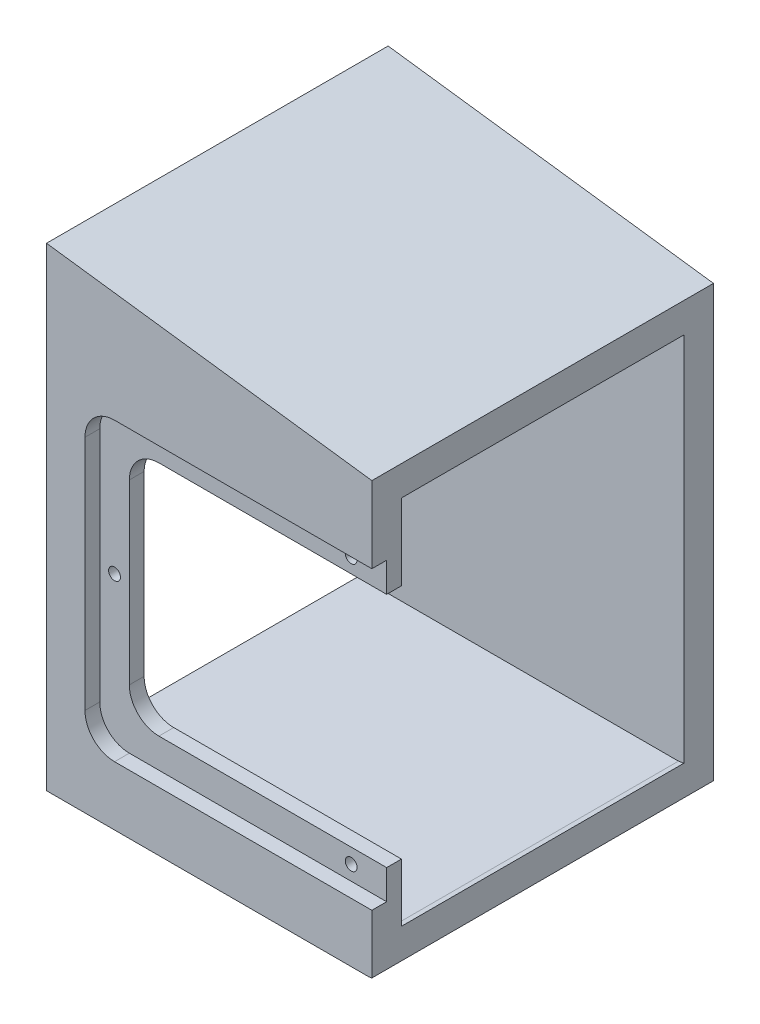
ISO-10303-21;
HEADER;
FILE_DESCRIPTION(('STEP AP214'),'2;1');
FILE_NAME('part.step','',(''),(''),'','','');
FILE_SCHEMA(('AUTOMOTIVE_DESIGN { 1 0 10303 214 1 1 1 1 }'));
ENDSEC;
DATA;
#1=APPLICATION_CONTEXT('core data for automotive mechanical design processes');
#2=APPLICATION_PROTOCOL_DEFINITION('international standard','automotive_design',2000,#1);
#3=PRODUCT_CONTEXT('',#1,'mechanical');
#4=PRODUCT('Part','Part','',(#3));
#5=PRODUCT_RELATED_PRODUCT_CATEGORY('part','',(#4));
#6=PRODUCT_DEFINITION_FORMATION('','',#4);
#7=PRODUCT_DEFINITION_CONTEXT('part definition',#1,'design');
#8=PRODUCT_DEFINITION('design','',#6,#7);
#9=PRODUCT_DEFINITION_SHAPE('','',#8);
#10=(LENGTH_UNIT() NAMED_UNIT(*) SI_UNIT(.MILLI.,.METRE.));
#11=(NAMED_UNIT(*) PLANE_ANGLE_UNIT() SI_UNIT($,.RADIAN.));
#12=(NAMED_UNIT(*) SI_UNIT($,.STERADIAN.) SOLID_ANGLE_UNIT());
#13=UNCERTAINTY_MEASURE_WITH_UNIT(LENGTH_MEASURE(1.E-05),#10,'distance_accuracy_value','');
#14=(GEOMETRIC_REPRESENTATION_CONTEXT(3) GLOBAL_UNCERTAINTY_ASSIGNED_CONTEXT((#13)) GLOBAL_UNIT_ASSIGNED_CONTEXT((#10,
#11,#12)) REPRESENTATION_CONTEXT('',''));
#15=CARTESIAN_POINT('',(0.,0.,0.));
#16=DIRECTION('',(0.,0.,1.));
#17=DIRECTION('',(1.,0.,0.));
#18=AXIS2_PLACEMENT_3D('',#15,#16,#17);
#19=CARTESIAN_POINT('',(82.,0.,0.));
#20=DIRECTION('',(1.,0.,0.));
#21=DIRECTION('',(0.,0.,-1.));
#22=AXIS2_PLACEMENT_3D('',#19,#20,#21);
#23=PLANE('',#22);
#24=DIRECTION('',(0.,1.,0.));
#25=VECTOR('',#24,1.);
#26=CARTESIAN_POINT('',(82.,0.,57.75));
#27=LINE('',#26,#25);
#28=CARTESIAN_POINT('',(82.,-118.,57.75));
#29=VERTEX_POINT('',#28);
#30=CARTESIAN_POINT('',(82.,42.3112777177944,57.75));
#31=VERTEX_POINT('',#30);
#32=EDGE_CURVE('E285',#29,#31,#27,.T.);
#33=ORIENTED_EDGE('',*,*,#32,.T.);
#34=DIRECTION('',(0.,0.,1.));
#35=VECTOR('',#34,1.);
#36=CARTESIAN_POINT('',(82.,42.3112777177944,57.75));
#37=LINE('',#36,#35);
#38=CARTESIAN_POINT('',(82.,42.3112777177944,-57.75));
#39=VERTEX_POINT('',#38);
#40=EDGE_CURVE('E218',#39,#31,#37,.T.);
#41=ORIENTED_EDGE('',*,*,#40,.F.);
#42=DIRECTION('',(0.,1.,0.));
#43=VECTOR('',#42,1.);
#44=CARTESIAN_POINT('',(82.,0.,-57.75));
#45=LINE('',#44,#43);
#46=CARTESIAN_POINT('',(82.,-118.,-57.75));
#47=VERTEX_POINT('',#46);
#48=EDGE_CURVE('E342',#47,#39,#45,.T.);
#49=ORIENTED_EDGE('',*,*,#48,.F.);
#50=DIRECTION('',(0.,0.,-1.));
#51=VECTOR('',#50,1.);
#52=CARTESIAN_POINT('',(82.,-118.,57.75));
#53=LINE('',#52,#51);
#54=EDGE_CURVE('E345',#29,#47,#53,.T.);
#55=ORIENTED_EDGE('',*,*,#54,.F.);
#56=EDGE_LOOP('',(#33,#41,#49,#55));
#57=FACE_BOUND('',#56,.T.);
#58=DIRECTION('',(0.,0.,-1.));
#59=VECTOR('',#58,1.);
#60=CARTESIAN_POINT('',(82.,-108.,57.75));
#61=LINE('',#60,#59);
#62=CARTESIAN_POINT('',(82.,-108.,47.75));
#63=VERTEX_POINT('',#62);
#64=CARTESIAN_POINT('',(82.,-108.,-47.75));
#65=VERTEX_POINT('',#64);
#66=EDGE_CURVE('E290',#63,#65,#61,.T.);
#67=ORIENTED_EDGE('',*,*,#66,.T.);
#68=DIRECTION('',(0.,1.,0.));
#69=VECTOR('',#68,1.);
#70=CARTESIAN_POINT('',(82.,0.,-47.75));
#71=LINE('',#70,#69);
#72=CARTESIAN_POINT('',(82.,32.2247568314438,-47.75));
#73=VERTEX_POINT('',#72);
#74=EDGE_CURVE('E45',#65,#73,#71,.T.);
#75=ORIENTED_EDGE('',*,*,#74,.T.);
#76=DIRECTION('',(0.,0.,1.));
#77=VECTOR('',#76,1.);
#78=CARTESIAN_POINT('',(82.,32.2247568314438,57.75));
#79=LINE('',#78,#77);
#80=CARTESIAN_POINT('',(82.,32.2247568314438,47.75));
#81=VERTEX_POINT('',#80);
#82=EDGE_CURVE('E292',#73,#81,#79,.T.);
#83=ORIENTED_EDGE('',*,*,#82,.T.);
#84=DIRECTION('',(0.,1.,0.));
#85=VECTOR('',#84,1.);
#86=CARTESIAN_POINT('',(82.,0.,47.75));
#87=LINE('',#86,#85);
#88=EDGE_CURVE('E330',#63,#81,#87,.T.);
#89=ORIENTED_EDGE('',*,*,#88,.F.);
#90=EDGE_LOOP('',(#67,#75,#83,#89));
#91=FACE_BOUND('',#90,.T.);
#92=ADVANCED_FACE('F41',(#57,#91),#23,.F.);
#93=CARTESIAN_POINT('',(192.,0.,0.));
#94=DIRECTION('',(1.,0.,0.));
#95=DIRECTION('',(0.,0.,-1.));
#96=AXIS2_PLACEMENT_3D('',#93,#94,#95);
#97=PLANE('',#96);
#98=DIRECTION('',(0.,-1.,0.));
#99=VECTOR('',#98,1.);
#100=CARTESIAN_POINT('',(192.,-88.0000000000001,52.75));
#101=LINE('',#100,#99);
#102=CARTESIAN_POINT('',(192.,1.99999999999996,52.75));
#103=VERTEX_POINT('',#102);
#104=CARTESIAN_POINT('',(192.,-8.00000000000004,52.75));
#105=VERTEX_POINT('',#104);
#106=EDGE_CURVE('E308',#103,#105,#101,.T.);
#107=ORIENTED_EDGE('',*,*,#106,.T.);
#108=DIRECTION('',(0.,0.,-1.));
#109=VECTOR('',#108,1.);
#110=CARTESIAN_POINT('',(192.,-8.00000000000004,-57.751));
#111=LINE('',#110,#109);
#112=CARTESIAN_POINT('',(192.,-8.00000000000004,47.75));
#113=VERTEX_POINT('',#112);
#114=EDGE_CURVE('E306',#105,#113,#111,.T.);
#115=ORIENTED_EDGE('',*,*,#114,.T.);
#116=DIRECTION('',(0.,1.,0.));
#117=VECTOR('',#116,1.);
#118=CARTESIAN_POINT('',(192.,0.,47.75));
#119=LINE('',#118,#117);
#120=CARTESIAN_POINT('',(192.,17.7235039722908,47.75));
#121=VERTEX_POINT('',#120);
#122=EDGE_CURVE('E298',#113,#121,#119,.T.);
#123=ORIENTED_EDGE('',*,*,#122,.T.);
#124=DIRECTION('',(0.,0.,1.));
#125=VECTOR('',#124,1.);
#126=CARTESIAN_POINT('',(192.,17.7235039722908,57.75));
#127=LINE('',#126,#125);
#128=CARTESIAN_POINT('',(192.,17.7235039722908,-47.75));
#129=VERTEX_POINT('',#128);
#130=EDGE_CURVE('E325',#129,#121,#127,.T.);
#131=ORIENTED_EDGE('',*,*,#130,.F.);
#132=DIRECTION('',(0.,1.,0.));
#133=VECTOR('',#132,1.);
#134=CARTESIAN_POINT('',(192.,0.,-47.75));
#135=LINE('',#134,#133);
#136=CARTESIAN_POINT('',(192.,-107.686529193614,-47.75));
#137=VERTEX_POINT('',#136);
#138=EDGE_CURVE('E327',#137,#129,#135,.T.);
#139=ORIENTED_EDGE('',*,*,#138,.F.);
#140=DIRECTION('',(0.,0.,-1.));
#141=VECTOR('',#140,1.);
#142=CARTESIAN_POINT('',(192.,-107.686529193614,57.75));
#143=LINE('',#142,#141);
#144=CARTESIAN_POINT('',(192.,-107.686529193614,47.75));
#145=VERTEX_POINT('',#144);
#146=EDGE_CURVE('E331',#145,#137,#143,.T.);
#147=ORIENTED_EDGE('',*,*,#146,.F.);
#148=CARTESIAN_POINT('',(192.,-88.0000000000001,47.75));
#149=VERTEX_POINT('',#148);
#150=EDGE_CURVE('E294',#145,#149,#119,.T.);
#151=ORIENTED_EDGE('',*,*,#150,.T.);
#152=DIRECTION('',(0.,0.,-1.));
#153=VECTOR('',#152,1.);
#154=CARTESIAN_POINT('',(192.,-88.0000000000001,-57.751));
#155=LINE('',#154,#153);
#156=CARTESIAN_POINT('',(192.,-88.0000000000001,52.75));
#157=VERTEX_POINT('',#156);
#158=EDGE_CURVE('E284',#157,#149,#155,.T.);
#159=ORIENTED_EDGE('',*,*,#158,.F.);
#160=CARTESIAN_POINT('',(192.,-98.,52.75));
#161=VERTEX_POINT('',#160);
#162=EDGE_CURVE('E225',#157,#161,#101,.T.);
#163=ORIENTED_EDGE('',*,*,#162,.T.);
#164=DIRECTION('',(0.,0.,1.));
#165=VECTOR('',#164,1.);
#166=CARTESIAN_POINT('',(192.,-98.,52.75));
#167=LINE('',#166,#165);
#168=CARTESIAN_POINT('',(192.,-98.,57.75));
#169=VERTEX_POINT('',#168);
#170=EDGE_CURVE('E204',#161,#169,#167,.T.);
#171=ORIENTED_EDGE('',*,*,#170,.T.);
#172=DIRECTION('',(0.,1.,0.));
#173=VECTOR('',#172,1.);
#174=CARTESIAN_POINT('',(192.,0.,57.75));
#175=LINE('',#174,#173);
#176=CARTESIAN_POINT('',(192.,-117.83,57.75));
#177=VERTEX_POINT('',#176);
#178=EDGE_CURVE('E210',#177,#169,#175,.T.);
#179=ORIENTED_EDGE('',*,*,#178,.F.);
#180=DIRECTION('',(0.,0.,-1.));
#181=VECTOR('',#180,1.);
#182=CARTESIAN_POINT('',(192.,-117.83,57.75));
#183=LINE('',#182,#181);
#184=CARTESIAN_POINT('',(192.,-117.83,-57.75));
#185=VERTEX_POINT('',#184);
#186=EDGE_CURVE('E344',#177,#185,#183,.T.);
#187=ORIENTED_EDGE('',*,*,#186,.T.);
#188=DIRECTION('',(0.,1.,0.));
#189=VECTOR('',#188,1.);
#190=CARTESIAN_POINT('',(192.,0.,-57.75));
#191=LINE('',#190,#189);
#192=CARTESIAN_POINT('',(192.,27.8100248586414,-57.75));
#193=VERTEX_POINT('',#192);
#194=EDGE_CURVE('E289',#185,#193,#191,.T.);
#195=ORIENTED_EDGE('',*,*,#194,.T.);
#196=DIRECTION('',(0.,0.,1.));
#197=VECTOR('',#196,1.);
#198=CARTESIAN_POINT('',(192.,27.8100248586414,57.75));
#199=LINE('',#198,#197);
#200=CARTESIAN_POINT('',(192.,27.8100248586414,57.75));
#201=VERTEX_POINT('',#200);
#202=EDGE_CURVE('E288',#193,#201,#199,.T.);
#203=ORIENTED_EDGE('',*,*,#202,.T.);
#204=CARTESIAN_POINT('',(192.,1.99999999999996,57.75));
#205=VERTEX_POINT('',#204);
#206=EDGE_CURVE('E217',#205,#201,#175,.T.);
#207=ORIENTED_EDGE('',*,*,#206,.F.);
#208=DIRECTION('',(0.,0.,-1.));
#209=VECTOR('',#208,1.);
#210=CARTESIAN_POINT('',(192.,1.99999999999996,52.75));
#211=LINE('',#210,#209);
#212=EDGE_CURVE('E226',#205,#103,#211,.T.);
#213=ORIENTED_EDGE('',*,*,#212,.T.);
#214=EDGE_LOOP('',(#107,#115,#123,#131,#139,#147,#151,#159,#163,#171,#179,#187,#195,#203,#207,#213));
#215=FACE_BOUND('',#214,.T.);
#216=ADVANCED_FACE('F222',(#215),#97,.T.);
#217=CARTESIAN_POINT('',(274.,17.,57.75));
#218=DIRECTION('',(-0.130698754240664,-0.991422127874872,0.));
#219=DIRECTION('',(0.991422127874872,-0.130698754240664,0.));
#220=AXIS2_PLACEMENT_3D('',#217,#218,#219);
#221=PLANE('',#220);
#222=ORIENTED_EDGE('',*,*,#202,.F.);
#223=DIRECTION('',(-0.991422127874872,0.130698754240664,0.));
#224=VECTOR('',#223,1.);
#225=CARTESIAN_POINT('',(274.,17.,-57.75));
#226=LINE('',#225,#224);
#227=EDGE_CURVE('E247',#193,#39,#226,.T.);
#228=ORIENTED_EDGE('',*,*,#227,.T.);
#229=ORIENTED_EDGE('',*,*,#40,.T.);
#230=DIRECTION('',(-0.991422127874872,0.130698754240664,0.));
#231=VECTOR('',#230,1.);
#232=CARTESIAN_POINT('',(274.,17.,57.75));
#233=LINE('',#232,#231);
#234=EDGE_CURVE('E243',#201,#31,#233,.T.);
#235=ORIENTED_EDGE('',*,*,#234,.F.);
#236=EDGE_LOOP('',(#222,#228,#229,#235));
#237=FACE_BOUND('',#236,.T.);
#238=ADVANCED_FACE('F352',(#237),#221,.F.);
#239=CARTESIAN_POINT('',(191.,-118.,57.75));
#240=DIRECTION('',(0.,1.,0.));
#241=DIRECTION('',(-1.,0.,0.));
#242=AXIS2_PLACEMENT_3D('',#239,#240,#241);
#243=PLANE('',#242);
#244=DIRECTION('',(1.,0.,0.));
#245=VECTOR('',#244,1.);
#246=CARTESIAN_POINT('',(191.,-118.,57.75));
#247=LINE('',#246,#245);
#248=CARTESIAN_POINT('',(191.,-118.,57.75));
#249=VERTEX_POINT('',#248);
#250=EDGE_CURVE('E242',#29,#249,#247,.T.);
#251=ORIENTED_EDGE('',*,*,#250,.F.);
#252=ORIENTED_EDGE('',*,*,#54,.T.);
#253=DIRECTION('',(1.,0.,0.));
#254=VECTOR('',#253,1.);
#255=CARTESIAN_POINT('',(191.,-118.,-57.75));
#256=LINE('',#255,#254);
#257=CARTESIAN_POINT('',(191.,-118.,-57.75));
#258=VERTEX_POINT('',#257);
#259=EDGE_CURVE('E246',#47,#258,#256,.T.);
#260=ORIENTED_EDGE('',*,*,#259,.T.);
#261=DIRECTION('',(0.,0.,-1.));
#262=VECTOR('',#261,1.);
#263=CARTESIAN_POINT('',(191.,-118.,57.75));
#264=LINE('',#263,#262);
#265=EDGE_CURVE('E276',#249,#258,#264,.T.);
#266=ORIENTED_EDGE('',*,*,#265,.F.);
#267=EDGE_LOOP('',(#251,#252,#260,#266));
#268=FACE_BOUND('',#267,.T.);
#269=ADVANCED_FACE('F452',(#268),#243,.F.);
#270=CARTESIAN_POINT('',(291.,-101.,57.75));
#271=DIRECTION('',(-0.167595493933869,0.985855846669817,0.));
#272=DIRECTION('',(-0.985855846669818,-0.167595493933869,0.));
#273=AXIS2_PLACEMENT_3D('',#270,#271,#272);
#274=PLANE('',#273);
#275=ORIENTED_EDGE('',*,*,#186,.F.);
#276=DIRECTION('',(0.985855846669817,0.167595493933869,0.));
#277=VECTOR('',#276,1.);
#278=CARTESIAN_POINT('',(291.,-101.,57.75));
#279=LINE('',#278,#277);
#280=EDGE_CURVE('E213',#249,#177,#279,.T.);
#281=ORIENTED_EDGE('',*,*,#280,.F.);
#282=ORIENTED_EDGE('',*,*,#265,.T.);
#283=DIRECTION('',(0.985855846669817,0.167595493933869,0.));
#284=VECTOR('',#283,1.);
#285=CARTESIAN_POINT('',(291.,-101.,-57.75));
#286=LINE('',#285,#284);
#287=EDGE_CURVE('E244',#258,#185,#286,.T.);
#288=ORIENTED_EDGE('',*,*,#287,.T.);
#289=EDGE_LOOP('',(#275,#281,#282,#288));
#290=FACE_BOUND('',#289,.T.);
#291=ADVANCED_FACE('F455',(#290),#274,.F.);
#292=CARTESIAN_POINT('',(0.,0.,-57.75));
#293=DIRECTION('',(0.,0.,1.));
#294=DIRECTION('',(1.,0.,0.));
#295=AXIS2_PLACEMENT_3D('',#292,#293,#294);
#296=PLANE('',#295);
#297=ORIENTED_EDGE('',*,*,#194,.F.);
#298=ORIENTED_EDGE('',*,*,#287,.F.);
#299=ORIENTED_EDGE('',*,*,#259,.F.);
#300=ORIENTED_EDGE('',*,*,#48,.T.);
#301=ORIENTED_EDGE('',*,*,#227,.F.);
#302=EDGE_LOOP('',(#297,#298,#299,#300,#301));
#303=FACE_BOUND('',#302,.T.);
#304=ADVANCED_FACE('F450',(#303),#296,.F.);
#305=CARTESIAN_POINT('',(191.,-108.,57.75));
#306=DIRECTION('',(0.,1.,0.));
#307=DIRECTION('',(-1.,0.,0.));
#308=AXIS2_PLACEMENT_3D('',#305,#306,#307);
#309=PLANE('',#308);
#310=ORIENTED_EDGE('',*,*,#66,.F.);
#311=DIRECTION('',(1.,0.,0.));
#312=VECTOR('',#311,1.);
#313=CARTESIAN_POINT('',(191.,-108.,47.75));
#314=LINE('',#313,#312);
#315=CARTESIAN_POINT('',(190.156054080084,-108.,47.75));
#316=VERTEX_POINT('',#315);
#317=EDGE_CURVE('E234',#63,#316,#314,.T.);
#318=ORIENTED_EDGE('',*,*,#317,.T.);
#319=DIRECTION('',(0.,0.,-1.));
#320=VECTOR('',#319,1.);
#321=CARTESIAN_POINT('',(190.156054080084,-108.,57.75));
#322=LINE('',#321,#320);
#323=CARTESIAN_POINT('',(190.156054080084,-108.,-47.75));
#324=VERTEX_POINT('',#323);
#325=EDGE_CURVE('E240',#316,#324,#322,.T.);
#326=ORIENTED_EDGE('',*,*,#325,.T.);
#327=DIRECTION('',(1.,0.,0.));
#328=VECTOR('',#327,1.);
#329=CARTESIAN_POINT('',(191.,-108.,-47.75));
#330=LINE('',#329,#328);
#331=EDGE_CURVE('E239',#65,#324,#330,.T.);
#332=ORIENTED_EDGE('',*,*,#331,.F.);
#333=EDGE_LOOP('',(#310,#318,#326,#332));
#334=FACE_BOUND('',#333,.T.);
#335=ADVANCED_FACE('F447',(#334),#309,.T.);
#336=CARTESIAN_POINT('',(272.693012457593,7.08577872125128,57.75));
#337=DIRECTION('',(-0.130698754240664,-0.991422127874872,0.));
#338=DIRECTION('',(0.991422127874872,-0.130698754240664,0.));
#339=AXIS2_PLACEMENT_3D('',#336,#337,#338);
#340=PLANE('',#339);
#341=DIRECTION('',(-0.991422127874872,0.130698754240664,0.));
#342=VECTOR('',#341,1.);
#343=CARTESIAN_POINT('',(272.693012457593,7.08577872125128,-47.75));
#344=LINE('',#343,#342);
#345=EDGE_CURVE('E278',#129,#73,#344,.T.);
#346=ORIENTED_EDGE('',*,*,#345,.F.);
#347=ORIENTED_EDGE('',*,*,#130,.T.);
#348=DIRECTION('',(-0.991422127874872,0.130698754240664,0.));
#349=VECTOR('',#348,1.);
#350=CARTESIAN_POINT('',(272.693012457593,7.08577872125128,47.75));
#351=LINE('',#350,#349);
#352=EDGE_CURVE('E235',#121,#81,#351,.T.);
#353=ORIENTED_EDGE('',*,*,#352,.T.);
#354=ORIENTED_EDGE('',*,*,#82,.F.);
#355=EDGE_LOOP('',(#346,#347,#353,#354));
#356=FACE_BOUND('',#355,.T.);
#357=ADVANCED_FACE('F333',(#356),#340,.T.);
#358=CARTESIAN_POINT('',(289.324045060661,-91.1414415333018,57.75));
#359=DIRECTION('',(-0.167595493933869,0.985855846669817,0.));
#360=DIRECTION('',(-0.985855846669818,-0.167595493933869,0.));
#361=AXIS2_PLACEMENT_3D('',#358,#359,#360);
#362=PLANE('',#361);
#363=DIRECTION('',(0.985855846669818,0.167595493933869,0.));
#364=VECTOR('',#363,1.);
#365=CARTESIAN_POINT('',(289.324045060661,-91.1414415333018,47.75));
#366=LINE('',#365,#364);
#367=EDGE_CURVE('E232',#316,#145,#366,.T.);
#368=ORIENTED_EDGE('',*,*,#367,.T.);
#369=ORIENTED_EDGE('',*,*,#146,.T.);
#370=DIRECTION('',(0.985855846669818,0.167595493933869,0.));
#371=VECTOR('',#370,1.);
#372=CARTESIAN_POINT('',(289.324045060661,-91.1414415333018,-47.75));
#373=LINE('',#372,#371);
#374=EDGE_CURVE('E236',#324,#137,#373,.T.);
#375=ORIENTED_EDGE('',*,*,#374,.F.);
#376=ORIENTED_EDGE('',*,*,#325,.F.);
#377=EDGE_LOOP('',(#368,#369,#375,#376));
#378=FACE_BOUND('',#377,.T.);
#379=ADVANCED_FACE('F493',(#378),#362,.T.);
#380=CARTESIAN_POINT('',(0.,0.,-47.75));
#381=DIRECTION('',(0.,0.,1.));
#382=DIRECTION('',(1.,0.,0.));
#383=AXIS2_PLACEMENT_3D('',#380,#381,#382);
#384=PLANE('',#383);
#385=ORIENTED_EDGE('',*,*,#374,.T.);
#386=ORIENTED_EDGE('',*,*,#138,.T.);
#387=ORIENTED_EDGE('',*,*,#345,.T.);
#388=ORIENTED_EDGE('',*,*,#74,.F.);
#389=ORIENTED_EDGE('',*,*,#331,.T.);
#390=EDGE_LOOP('',(#385,#386,#387,#388,#389));
#391=FACE_BOUND('',#390,.T.);
#392=ADVANCED_FACE('F335',(#391),#384,.T.);
#393=CARTESIAN_POINT('',(0.,0.,47.75));
#394=DIRECTION('',(0.,0.,1.));
#395=DIRECTION('',(1.,0.,0.));
#396=AXIS2_PLACEMENT_3D('',#393,#394,#395);
#397=PLANE('',#396);
#398=CARTESIAN_POINT('',(99.9971523214083,-48.,47.75));
#399=DIRECTION('',(0.,0.,1.));
#400=DIRECTION('',(1.,0.,0.));
#401=AXIS2_PLACEMENT_3D('',#398,#399,#400);
#402=CIRCLE('',#401,2.);
#403=CARTESIAN_POINT('',(101.997152321408,-48.,47.75));
#404=VERTEX_POINT('',#403);
#405=EDGE_CURVE('E11',#404,#404,#402,.T.);
#406=ORIENTED_EDGE('',*,*,#405,.T.);
#407=EDGE_LOOP('',(#406));
#408=FACE_BOUND('',#407,.T.);
#409=CARTESIAN_POINT('',(180.,-93.,47.75));
#410=DIRECTION('',(0.,0.,1.));
#411=DIRECTION('',(1.,0.,0.));
#412=AXIS2_PLACEMENT_3D('',#409,#410,#411);
#413=CIRCLE('',#412,2.);
#414=CARTESIAN_POINT('',(182.,-93.,47.75));
#415=VERTEX_POINT('',#414);
#416=EDGE_CURVE('E407',#415,#415,#413,.T.);
#417=ORIENTED_EDGE('',*,*,#416,.T.);
#418=EDGE_LOOP('',(#417));
#419=FACE_BOUND('',#418,.T.);
#420=CARTESIAN_POINT('',(180.,-3.00000000000003,47.75));
#421=DIRECTION('',(0.,0.,1.));
#422=DIRECTION('',(1.,0.,0.));
#423=AXIS2_PLACEMENT_3D('',#420,#421,#422);
#424=CIRCLE('',#423,2.);
#425=CARTESIAN_POINT('',(182.,-3.00000000000003,47.75));
#426=VERTEX_POINT('',#425);
#427=EDGE_CURVE('E399',#426,#426,#424,.T.);
#428=ORIENTED_EDGE('',*,*,#427,.T.);
#429=EDGE_LOOP('',(#428));
#430=FACE_BOUND('',#429,.T.);
#431=ORIENTED_EDGE('',*,*,#150,.F.);
#432=ORIENTED_EDGE('',*,*,#367,.F.);
#433=ORIENTED_EDGE('',*,*,#317,.F.);
#434=ORIENTED_EDGE('',*,*,#88,.T.);
#435=ORIENTED_EDGE('',*,*,#352,.F.);
#436=ORIENTED_EDGE('',*,*,#122,.F.);
#437=DIRECTION('',(1.,0.,0.));
#438=VECTOR('',#437,1.);
#439=CARTESIAN_POINT('',(0.,-8.00000000000006,47.75));
#440=LINE('',#439,#438);
#441=CARTESIAN_POINT('',(115.,-8.00000000000005,47.75));
#442=VERTEX_POINT('',#441);
#443=EDGE_CURVE('E253',#442,#113,#440,.T.);
#444=ORIENTED_EDGE('',*,*,#443,.F.);
#445=CARTESIAN_POINT('',(115.,-18.,47.75));
#446=DIRECTION('',(0.,0.,1.));
#447=DIRECTION('',(1.,0.,0.));
#448=AXIS2_PLACEMENT_3D('',#445,#446,#447);
#449=CIRCLE('',#448,10.);
#450=CARTESIAN_POINT('',(105.,-18.0000000000001,47.75));
#451=VERTEX_POINT('',#450);
#452=EDGE_CURVE('E256',#451,#442,#449,.F.);
#453=ORIENTED_EDGE('',*,*,#452,.F.);
#454=DIRECTION('',(0.,-1.,0.));
#455=VECTOR('',#454,1.);
#456=CARTESIAN_POINT('',(105.,0.,47.75));
#457=LINE('',#456,#455);
#458=CARTESIAN_POINT('',(105.,-78.,47.75));
#459=VERTEX_POINT('',#458);
#460=EDGE_CURVE('E379',#451,#459,#457,.T.);
#461=ORIENTED_EDGE('',*,*,#460,.T.);
#462=CARTESIAN_POINT('',(115.,-78.0000000000001,47.75));
#463=DIRECTION('',(0.,0.,1.));
#464=DIRECTION('',(1.,0.,0.));
#465=AXIS2_PLACEMENT_3D('',#462,#463,#464);
#466=CIRCLE('',#465,9.99999999999999);
#467=CARTESIAN_POINT('',(115.,-88.0000000000001,47.75));
#468=VERTEX_POINT('',#467);
#469=EDGE_CURVE('E251',#459,#468,#466,.T.);
#470=ORIENTED_EDGE('',*,*,#469,.T.);
#471=DIRECTION('',(1.,0.,0.));
#472=VECTOR('',#471,1.);
#473=CARTESIAN_POINT('',(0.,-88.0000000000001,47.75));
#474=LINE('',#473,#472);
#475=EDGE_CURVE('E248',#468,#149,#474,.T.);
#476=ORIENTED_EDGE('',*,*,#475,.T.);
#477=EDGE_LOOP('',(#431,#432,#433,#434,#435,#436,#444,#453,#461,#470,#476));
#478=FACE_BOUND('',#477,.T.);
#479=ADVANCED_FACE('F322',(#408,#419,#430,#478),#397,.F.);
#480=CARTESIAN_POINT('',(0.,-8.00000000000006,-57.751));
#481=DIRECTION('',(0.,1.,0.));
#482=DIRECTION('',(-1.,0.,0.));
#483=AXIS2_PLACEMENT_3D('',#480,#481,#482);
#484=PLANE('',#483);
#485=ORIENTED_EDGE('',*,*,#114,.F.);
#486=DIRECTION('',(-1.,0.,0.));
#487=VECTOR('',#486,1.);
#488=CARTESIAN_POINT('',(0.,-8.00000000000006,52.75));
#489=LINE('',#488,#487);
#490=CARTESIAN_POINT('',(115.,-8.00000000000005,52.75));
#491=VERTEX_POINT('',#490);
#492=EDGE_CURVE('E259',#105,#491,#489,.T.);
#493=ORIENTED_EDGE('',*,*,#492,.T.);
#494=DIRECTION('',(0.,0.,1.));
#495=VECTOR('',#494,1.);
#496=CARTESIAN_POINT('',(115.,-8.00000000000005,-57.751));
#497=LINE('',#496,#495);
#498=EDGE_CURVE('E252',#442,#491,#497,.T.);
#499=ORIENTED_EDGE('',*,*,#498,.F.);
#500=ORIENTED_EDGE('',*,*,#443,.T.);
#501=EDGE_LOOP('',(#485,#493,#499,#500));
#502=FACE_BOUND('',#501,.T.);
#503=ADVANCED_FACE('F316',(#502),#484,.F.);
#504=CARTESIAN_POINT('',(115.,-18.,-57.751));
#505=DIRECTION('',(0.,0.,1.));
#506=DIRECTION('',(1.,0.,0.));
#507=AXIS2_PLACEMENT_3D('',#504,#505,#506);
#508=CYLINDRICAL_SURFACE('',#507,10.);
#509=ORIENTED_EDGE('',*,*,#498,.T.);
#510=CARTESIAN_POINT('',(115.,-18.,52.75));
#511=DIRECTION('',(0.,0.,-1.));
#512=DIRECTION('',(-1.,0.,0.));
#513=AXIS2_PLACEMENT_3D('',#510,#511,#512);
#514=CIRCLE('',#513,10.);
#515=CARTESIAN_POINT('',(105.,-18.,52.75));
#516=VERTEX_POINT('',#515);
#517=EDGE_CURVE('E261',#491,#516,#514,.F.);
#518=ORIENTED_EDGE('',*,*,#517,.T.);
#519=DIRECTION('',(0.,0.,1.));
#520=VECTOR('',#519,1.);
#521=CARTESIAN_POINT('',(105.,-18.0000000000001,-57.751));
#522=LINE('',#521,#520);
#523=EDGE_CURVE('E369',#451,#516,#522,.T.);
#524=ORIENTED_EDGE('',*,*,#523,.F.);
#525=ORIENTED_EDGE('',*,*,#452,.T.);
#526=EDGE_LOOP('',(#509,#518,#524,#525));
#527=FACE_BOUND('',#526,.T.);
#528=ADVANCED_FACE('F457',(#527),#508,.F.);
#529=CARTESIAN_POINT('',(105.,0.,-57.751));
#530=DIRECTION('',(1.,0.,0.));
#531=DIRECTION('',(0.,0.,-1.));
#532=AXIS2_PLACEMENT_3D('',#529,#530,#531);
#533=PLANE('',#532);
#534=DIRECTION('',(0.,1.,0.));
#535=VECTOR('',#534,1.);
#536=CARTESIAN_POINT('',(105.,0.,52.75));
#537=LINE('',#536,#535);
#538=CARTESIAN_POINT('',(105.,-78.,52.75));
#539=VERTEX_POINT('',#538);
#540=EDGE_CURVE('E384',#539,#516,#537,.T.);
#541=ORIENTED_EDGE('',*,*,#540,.F.);
#542=DIRECTION('',(0.,0.,1.));
#543=VECTOR('',#542,1.);
#544=CARTESIAN_POINT('',(105.,-78.,-57.751));
#545=LINE('',#544,#543);
#546=EDGE_CURVE('E372',#459,#539,#545,.T.);
#547=ORIENTED_EDGE('',*,*,#546,.F.);
#548=ORIENTED_EDGE('',*,*,#460,.F.);
#549=ORIENTED_EDGE('',*,*,#523,.T.);
#550=EDGE_LOOP('',(#541,#547,#548,#549));
#551=FACE_BOUND('',#550,.T.);
#552=ADVANCED_FACE('F460',(#551),#533,.T.);
#553=CARTESIAN_POINT('',(115.,-78.0000000000001,-57.751));
#554=DIRECTION('',(0.,0.,1.));
#555=DIRECTION('',(1.,0.,0.));
#556=AXIS2_PLACEMENT_3D('',#553,#554,#555);
#557=CYLINDRICAL_SURFACE('',#556,9.99999999999999);
#558=CARTESIAN_POINT('',(115.,-78.0000000000001,52.75));
#559=DIRECTION('',(0.,0.,-1.));
#560=DIRECTION('',(-1.,0.,0.));
#561=AXIS2_PLACEMENT_3D('',#558,#559,#560);
#562=CIRCLE('',#561,9.99999999999999);
#563=CARTESIAN_POINT('',(115.,-88.0000000000001,52.75));
#564=VERTEX_POINT('',#563);
#565=EDGE_CURVE('E258',#564,#539,#562,.T.);
#566=ORIENTED_EDGE('',*,*,#565,.F.);
#567=DIRECTION('',(0.,0.,1.));
#568=VECTOR('',#567,1.);
#569=CARTESIAN_POINT('',(115.,-88.0000000000001,-57.751));
#570=LINE('',#569,#568);
#571=EDGE_CURVE('E270',#468,#564,#570,.T.);
#572=ORIENTED_EDGE('',*,*,#571,.F.);
#573=ORIENTED_EDGE('',*,*,#469,.F.);
#574=ORIENTED_EDGE('',*,*,#546,.T.);
#575=EDGE_LOOP('',(#566,#572,#573,#574));
#576=FACE_BOUND('',#575,.T.);
#577=ADVANCED_FACE('F464',(#576),#557,.F.);
#578=CARTESIAN_POINT('',(0.,-88.0000000000001,-57.751));
#579=DIRECTION('',(0.,1.,0.));
#580=DIRECTION('',(-1.,0.,0.));
#581=AXIS2_PLACEMENT_3D('',#578,#579,#580);
#582=PLANE('',#581);
#583=DIRECTION('',(-1.,0.,0.));
#584=VECTOR('',#583,1.);
#585=CARTESIAN_POINT('',(0.,-88.0000000000001,52.75));
#586=LINE('',#585,#584);
#587=EDGE_CURVE('E255',#157,#564,#586,.T.);
#588=ORIENTED_EDGE('',*,*,#587,.F.);
#589=ORIENTED_EDGE('',*,*,#158,.T.);
#590=ORIENTED_EDGE('',*,*,#475,.F.);
#591=ORIENTED_EDGE('',*,*,#571,.T.);
#592=EDGE_LOOP('',(#588,#589,#590,#591));
#593=FACE_BOUND('',#592,.T.);
#594=ADVANCED_FACE('F467',(#593),#582,.T.);
#595=CARTESIAN_POINT('',(95.,-88.,52.75));
#596=DIRECTION('',(-1.,0.,0.));
#597=DIRECTION('',(0.,0.,1.));
#598=AXIS2_PLACEMENT_3D('',#595,#596,#597);
#599=PLANE('',#598);
#600=DIRECTION('',(0.,-1.,0.));
#601=VECTOR('',#600,1.);
#602=CARTESIAN_POINT('',(95.,-88.,57.75));
#603=LINE('',#602,#601);
#604=CARTESIAN_POINT('',(95.,-8.00000000000012,57.75));
#605=VERTEX_POINT('',#604);
#606=CARTESIAN_POINT('',(95.,-88.,57.75));
#607=VERTEX_POINT('',#606);
#608=EDGE_CURVE('E394',#605,#607,#603,.T.);
#609=ORIENTED_EDGE('',*,*,#608,.T.);
#610=DIRECTION('',(0.,0.,1.));
#611=VECTOR('',#610,1.);
#612=CARTESIAN_POINT('',(95.,-88.,52.75));
#613=LINE('',#612,#611);
#614=CARTESIAN_POINT('',(95.,-88.,52.75));
#615=VERTEX_POINT('',#614);
#616=EDGE_CURVE('E88',#615,#607,#613,.T.);
#617=ORIENTED_EDGE('',*,*,#616,.F.);
#618=DIRECTION('',(0.,-1.,0.));
#619=VECTOR('',#618,1.);
#620=CARTESIAN_POINT('',(95.,-88.,52.75));
#621=LINE('',#620,#619);
#622=CARTESIAN_POINT('',(95.,-8.00000000000012,52.75));
#623=VERTEX_POINT('',#622);
#624=EDGE_CURVE('E388',#623,#615,#621,.T.);
#625=ORIENTED_EDGE('',*,*,#624,.F.);
#626=DIRECTION('',(0.,0.,1.));
#627=VECTOR('',#626,1.);
#628=CARTESIAN_POINT('',(95.,-8.00000000000012,52.75));
#629=LINE('',#628,#627);
#630=EDGE_CURVE('E391',#623,#605,#629,.T.);
#631=ORIENTED_EDGE('',*,*,#630,.T.);
#632=EDGE_LOOP('',(#609,#617,#625,#631));
#633=FACE_BOUND('',#632,.T.);
#634=ADVANCED_FACE('F423',(#633),#599,.F.);
#635=CARTESIAN_POINT('',(180.,-3.00000000000003,47.75));
#636=DIRECTION('',(0.,0.,1.));
#637=DIRECTION('',(1.,0.,0.));
#638=AXIS2_PLACEMENT_3D('',#635,#636,#637);
#639=CYLINDRICAL_SURFACE('',#638,2.);
#640=ORIENTED_EDGE('',*,*,#427,.F.);
#641=EDGE_LOOP('',(#640));
#642=FACE_BOUND('',#641,.T.);
#643=CARTESIAN_POINT('',(180.,-3.00000000000003,52.75));
#644=DIRECTION('',(0.,0.,1.));
#645=DIRECTION('',(1.,0.,0.));
#646=AXIS2_PLACEMENT_3D('',#643,#644,#645);
#647=CIRCLE('',#646,2.);
#648=CARTESIAN_POINT('',(182.,-3.00000000000003,52.75));
#649=VERTEX_POINT('',#648);
#650=EDGE_CURVE('E413',#649,#649,#647,.T.);
#651=ORIENTED_EDGE('',*,*,#650,.T.);
#652=EDGE_LOOP('',(#651));
#653=FACE_BOUND('',#652,.T.);
#654=ADVANCED_FACE('F419',(#642,#653),#639,.F.);
#655=CARTESIAN_POINT('',(180.,-93.,47.75));
#656=DIRECTION('',(0.,0.,1.));
#657=DIRECTION('',(1.,0.,0.));
#658=AXIS2_PLACEMENT_3D('',#655,#656,#657);
#659=CYLINDRICAL_SURFACE('',#658,2.);
#660=ORIENTED_EDGE('',*,*,#416,.F.);
#661=EDGE_LOOP('',(#660));
#662=FACE_BOUND('',#661,.T.);
#663=CARTESIAN_POINT('',(180.,-93.,52.75));
#664=DIRECTION('',(0.,0.,1.));
#665=DIRECTION('',(1.,0.,0.));
#666=AXIS2_PLACEMENT_3D('',#663,#664,#665);
#667=CIRCLE('',#666,2.);
#668=CARTESIAN_POINT('',(182.,-93.,52.75));
#669=VERTEX_POINT('',#668);
#670=EDGE_CURVE('E410',#669,#669,#667,.T.);
#671=ORIENTED_EDGE('',*,*,#670,.T.);
#672=EDGE_LOOP('',(#671));
#673=FACE_BOUND('',#672,.T.);
#674=ADVANCED_FACE('F422',(#662,#673),#659,.F.);
#675=CARTESIAN_POINT('',(99.9971523214083,-48.,47.75));
#676=DIRECTION('',(0.,0.,1.));
#677=DIRECTION('',(1.,0.,0.));
#678=AXIS2_PLACEMENT_3D('',#675,#676,#677);
#679=CYLINDRICAL_SURFACE('',#678,2.);
#680=ORIENTED_EDGE('',*,*,#405,.F.);
#681=EDGE_LOOP('',(#680));
#682=FACE_BOUND('',#681,.T.);
#683=CARTESIAN_POINT('',(99.9971523214083,-48.,52.75));
#684=DIRECTION('',(0.,0.,1.));
#685=DIRECTION('',(1.,0.,0.));
#686=AXIS2_PLACEMENT_3D('',#683,#684,#685);
#687=CIRCLE('',#686,2.);
#688=CARTESIAN_POINT('',(101.997152321408,-48.,52.75));
#689=VERTEX_POINT('',#688);
#690=EDGE_CURVE('E51',#689,#689,#687,.T.);
#691=ORIENTED_EDGE('',*,*,#690,.T.);
#692=EDGE_LOOP('',(#691));
#693=FACE_BOUND('',#692,.T.);
#694=ADVANCED_FACE('F473',(#682,#693),#679,.F.);
#695=CARTESIAN_POINT('',(105.,-8.00000000000005,52.75));
#696=DIRECTION('',(0.,0.,1.));
#697=DIRECTION('',(1.,0.,0.));
#698=AXIS2_PLACEMENT_3D('',#695,#696,#697);
#699=CYLINDRICAL_SURFACE('',#698,10.);
#700=CARTESIAN_POINT('',(105.,-8.00000000000005,57.75));
#701=DIRECTION('',(0.,0.,1.));
#702=DIRECTION('',(1.,0.,0.));
#703=AXIS2_PLACEMENT_3D('',#700,#701,#702);
#704=CIRCLE('',#703,10.);
#705=CARTESIAN_POINT('',(105.,1.99999999999995,57.75));
#706=VERTEX_POINT('',#705);
#707=EDGE_CURVE('E267',#706,#605,#704,.T.);
#708=ORIENTED_EDGE('',*,*,#707,.T.);
#709=ORIENTED_EDGE('',*,*,#630,.F.);
#710=CARTESIAN_POINT('',(105.,-8.00000000000005,52.75));
#711=DIRECTION('',(0.,0.,1.));
#712=DIRECTION('',(1.,0.,0.));
#713=AXIS2_PLACEMENT_3D('',#710,#711,#712);
#714=CIRCLE('',#713,10.);
#715=CARTESIAN_POINT('',(105.,1.99999999999995,52.75));
#716=VERTEX_POINT('',#715);
#717=EDGE_CURVE('E264',#716,#623,#714,.T.);
#718=ORIENTED_EDGE('',*,*,#717,.F.);
#719=DIRECTION('',(0.,0.,1.));
#720=VECTOR('',#719,1.);
#721=CARTESIAN_POINT('',(105.,1.99999999999995,52.75));
#722=LINE('',#721,#720);
#723=EDGE_CURVE('E389',#716,#706,#722,.T.);
#724=ORIENTED_EDGE('',*,*,#723,.T.);
#725=EDGE_LOOP('',(#708,#709,#718,#724));
#726=FACE_BOUND('',#725,.T.);
#727=ADVANCED_FACE('F470',(#726),#699,.F.);
#728=CARTESIAN_POINT('',(0.,0.,57.75));
#729=DIRECTION('',(0.,0.,1.));
#730=DIRECTION('',(1.,0.,0.));
#731=AXIS2_PLACEMENT_3D('',#728,#729,#730);
#732=PLANE('',#731);
#733=ORIENTED_EDGE('',*,*,#280,.T.);
#734=ORIENTED_EDGE('',*,*,#178,.T.);
#735=DIRECTION('',(1.,0.,0.));
#736=VECTOR('',#735,1.);
#737=CARTESIAN_POINT('',(255.,-98.,57.75));
#738=LINE('',#737,#736);
#739=CARTESIAN_POINT('',(105.,-98.0000000000001,57.75));
#740=VERTEX_POINT('',#739);
#741=EDGE_CURVE('E200',#740,#169,#738,.T.);
#742=ORIENTED_EDGE('',*,*,#741,.F.);
#743=CARTESIAN_POINT('',(105.,-88.0000000000001,57.75));
#744=DIRECTION('',(0.,0.,1.));
#745=DIRECTION('',(-1.,0.,0.));
#746=AXIS2_PLACEMENT_3D('',#743,#744,#745);
#747=CIRCLE('',#746,9.99999999999999);
#748=EDGE_CURVE('E207',#607,#740,#747,.T.);
#749=ORIENTED_EDGE('',*,*,#748,.F.);
#750=ORIENTED_EDGE('',*,*,#608,.F.);
#751=ORIENTED_EDGE('',*,*,#707,.F.);
#752=DIRECTION('',(-1.,0.,0.));
#753=VECTOR('',#752,1.);
#754=CARTESIAN_POINT('',(255.,1.99999999999997,57.75));
#755=LINE('',#754,#753);
#756=EDGE_CURVE('E60',#205,#706,#755,.T.);
#757=ORIENTED_EDGE('',*,*,#756,.F.);
#758=ORIENTED_EDGE('',*,*,#206,.T.);
#759=ORIENTED_EDGE('',*,*,#234,.T.);
#760=ORIENTED_EDGE('',*,*,#32,.F.);
#761=ORIENTED_EDGE('',*,*,#250,.T.);
#762=EDGE_LOOP('',(#733,#734,#742,#749,#750,#751,#757,#758,#759,#760,#761));
#763=FACE_BOUND('',#762,.T.);
#764=ADVANCED_FACE('F211',(#763),#732,.T.);
#765=CARTESIAN_POINT('',(105.,-88.0000000000001,52.75));
#766=DIRECTION('',(0.,0.,1.));
#767=DIRECTION('',(1.,0.,0.));
#768=AXIS2_PLACEMENT_3D('',#765,#766,#767);
#769=CYLINDRICAL_SURFACE('',#768,9.99999999999999);
#770=ORIENTED_EDGE('',*,*,#748,.T.);
#771=DIRECTION('',(0.,0.,1.));
#772=VECTOR('',#771,1.);
#773=CARTESIAN_POINT('',(105.,-98.0000000000001,52.75));
#774=LINE('',#773,#772);
#775=CARTESIAN_POINT('',(105.,-98.0000000000001,52.75));
#776=VERTEX_POINT('',#775);
#777=EDGE_CURVE('E85',#776,#740,#774,.T.);
#778=ORIENTED_EDGE('',*,*,#777,.F.);
#779=CARTESIAN_POINT('',(105.,-88.0000000000001,52.75));
#780=DIRECTION('',(0.,0.,1.));
#781=DIRECTION('',(-1.,0.,0.));
#782=AXIS2_PLACEMENT_3D('',#779,#780,#781);
#783=CIRCLE('',#782,9.99999999999999);
#784=EDGE_CURVE('E266',#615,#776,#783,.T.);
#785=ORIENTED_EDGE('',*,*,#784,.F.);
#786=ORIENTED_EDGE('',*,*,#616,.T.);
#787=EDGE_LOOP('',(#770,#778,#785,#786));
#788=FACE_BOUND('',#787,.T.);
#789=ADVANCED_FACE('F428',(#788),#769,.F.);
#790=CARTESIAN_POINT('',(105.,-88.0000000000001,52.75));
#791=DIRECTION('',(0.,0.,-1.));
#792=DIRECTION('',(-1.,0.,0.));
#793=AXIS2_PLACEMENT_3D('',#790,#791,#792);
#794=PLANE('',#793);
#795=ORIENTED_EDGE('',*,*,#690,.F.);
#796=EDGE_LOOP('',(#795));
#797=FACE_BOUND('',#796,.T.);
#798=ORIENTED_EDGE('',*,*,#670,.F.);
#799=EDGE_LOOP('',(#798));
#800=FACE_BOUND('',#799,.T.);
#801=ORIENTED_EDGE('',*,*,#650,.F.);
#802=EDGE_LOOP('',(#801));
#803=FACE_BOUND('',#802,.T.);
#804=ORIENTED_EDGE('',*,*,#106,.F.);
#805=DIRECTION('',(-1.,0.,0.));
#806=VECTOR('',#805,1.);
#807=CARTESIAN_POINT('',(255.,1.99999999999997,52.75));
#808=LINE('',#807,#806);
#809=EDGE_CURVE('E79',#103,#716,#808,.T.);
#810=ORIENTED_EDGE('',*,*,#809,.T.);
#811=ORIENTED_EDGE('',*,*,#717,.T.);
#812=ORIENTED_EDGE('',*,*,#624,.T.);
#813=ORIENTED_EDGE('',*,*,#784,.T.);
#814=DIRECTION('',(1.,0.,0.));
#815=VECTOR('',#814,1.);
#816=CARTESIAN_POINT('',(255.,-98.,52.75));
#817=LINE('',#816,#815);
#818=EDGE_CURVE('E263',#776,#161,#817,.T.);
#819=ORIENTED_EDGE('',*,*,#818,.T.);
#820=ORIENTED_EDGE('',*,*,#162,.F.);
#821=ORIENTED_EDGE('',*,*,#587,.T.);
#822=ORIENTED_EDGE('',*,*,#565,.T.);
#823=ORIENTED_EDGE('',*,*,#540,.T.);
#824=ORIENTED_EDGE('',*,*,#517,.F.);
#825=ORIENTED_EDGE('',*,*,#492,.F.);
#826=EDGE_LOOP('',(#804,#810,#811,#812,#813,#819,#820,#821,#822,#823,#824,#825));
#827=FACE_BOUND('',#826,.T.);
#828=ADVANCED_FACE('F311',(#797,#800,#803,#827),#794,.F.);
#829=CARTESIAN_POINT('',(255.,-98.,52.75));
#830=DIRECTION('',(0.,-1.,0.));
#831=DIRECTION('',(1.,0.,0.));
#832=AXIS2_PLACEMENT_3D('',#829,#830,#831);
#833=PLANE('',#832);
#834=ORIENTED_EDGE('',*,*,#170,.F.);
#835=ORIENTED_EDGE('',*,*,#818,.F.);
#836=ORIENTED_EDGE('',*,*,#777,.T.);
#837=ORIENTED_EDGE('',*,*,#741,.T.);
#838=EDGE_LOOP('',(#834,#835,#836,#837));
#839=FACE_BOUND('',#838,.T.);
#840=ADVANCED_FACE('F202',(#839),#833,.F.);
#841=CARTESIAN_POINT('',(255.,1.99999999999997,52.75));
#842=DIRECTION('',(0.,1.,0.));
#843=DIRECTION('',(-1.,0.,0.));
#844=AXIS2_PLACEMENT_3D('',#841,#842,#843);
#845=PLANE('',#844);
#846=ORIENTED_EDGE('',*,*,#212,.F.);
#847=ORIENTED_EDGE('',*,*,#756,.T.);
#848=ORIENTED_EDGE('',*,*,#723,.F.);
#849=ORIENTED_EDGE('',*,*,#809,.F.);
#850=EDGE_LOOP('',(#846,#847,#848,#849));
#851=FACE_BOUND('',#850,.T.);
#852=ADVANCED_FACE('F43',(#851),#845,.F.);
#853=CLOSED_SHELL('',(#92,#216,#238,#269,#291,#304,#335,#357,#379,#392,#479,#503,#528,#552,#577,
#594,#634,#654,#674,#694,#727,#764,#789,#828,#840,#852));
#854=MANIFOLD_SOLID_BREP('B2',#853);
#855=ADVANCED_BREP_SHAPE_REPRESENTATION('',(#18,#854),#14);
#856=SHAPE_DEFINITION_REPRESENTATION(#9,#855);
ENDSEC;
END-ISO-10303-21;
